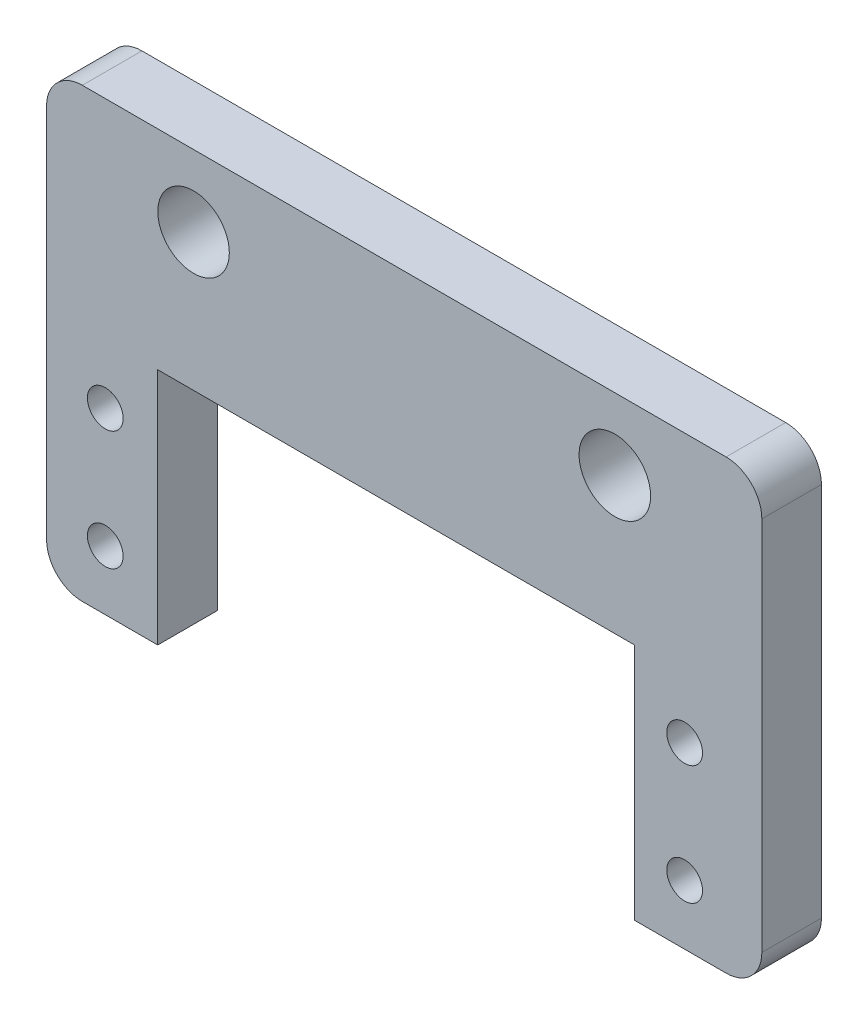
ISO-10303-21;
HEADER;
FILE_DESCRIPTION(('STEP AP214'),'2;1');
FILE_NAME('part.step','',(''),(''),'','','');
FILE_SCHEMA(('AUTOMOTIVE_DESIGN { 1 0 10303 214 1 1 1 1 }'));
ENDSEC;
DATA;
#1=APPLICATION_CONTEXT('core data for automotive mechanical design processes');
#2=APPLICATION_PROTOCOL_DEFINITION('international standard','automotive_design',2000,#1);
#3=PRODUCT_CONTEXT('',#1,'mechanical');
#4=PRODUCT('Part','Part','',(#3));
#5=PRODUCT_RELATED_PRODUCT_CATEGORY('part','',(#4));
#6=PRODUCT_DEFINITION_FORMATION('','',#4);
#7=PRODUCT_DEFINITION_CONTEXT('part definition',#1,'design');
#8=PRODUCT_DEFINITION('design','',#6,#7);
#9=PRODUCT_DEFINITION_SHAPE('','',#8);
#10=(LENGTH_UNIT() NAMED_UNIT(*) SI_UNIT(.MILLI.,.METRE.));
#11=(NAMED_UNIT(*) PLANE_ANGLE_UNIT() SI_UNIT($,.RADIAN.));
#12=(NAMED_UNIT(*) SI_UNIT($,.STERADIAN.) SOLID_ANGLE_UNIT());
#13=UNCERTAINTY_MEASURE_WITH_UNIT(LENGTH_MEASURE(1.E-05),#10,'distance_accuracy_value','');
#14=(GEOMETRIC_REPRESENTATION_CONTEXT(3) GLOBAL_UNCERTAINTY_ASSIGNED_CONTEXT((#13)) GLOBAL_UNIT_ASSIGNED_CONTEXT((#10,
#11,#12)) REPRESENTATION_CONTEXT('',''));
#15=CARTESIAN_POINT('',(0.,0.,0.));
#16=DIRECTION('',(0.,0.,1.));
#17=DIRECTION('',(1.,0.,0.));
#18=AXIS2_PLACEMENT_3D('',#15,#16,#17);
#19=CARTESIAN_POINT('',(-15.5,-7.,5.));
#20=DIRECTION('',(0.,0.,1.));
#21=DIRECTION('',(1.,0.,0.));
#22=AXIS2_PLACEMENT_3D('',#19,#20,#21);
#23=PLANE('',#22);
#24=CARTESIAN_POINT('',(-6.17,21.5,5.));
#25=DIRECTION('',(0.,0.,1.));
#26=DIRECTION('',(1.,0.,0.));
#27=AXIS2_PLACEMENT_3D('',#24,#25,#26);
#28=CIRCLE('',#27,3.);
#29=CARTESIAN_POINT('',(-3.17,21.5,5.));
#30=VERTEX_POINT('',#29);
#31=EDGE_CURVE('E214',#30,#30,#28,.T.);
#32=ORIENTED_EDGE('',*,*,#31,.F.);
#33=EDGE_LOOP('',(#32));
#34=FACE_BOUND('',#33,.T.);
#35=CARTESIAN_POINT('',(29.17,21.5,5.));
#36=DIRECTION('',(0.,0.,1.));
#37=DIRECTION('',(1.,0.,0.));
#38=AXIS2_PLACEMENT_3D('',#35,#36,#37);
#39=CIRCLE('',#38,3.);
#40=CARTESIAN_POINT('',(32.17,21.5,5.));
#41=VERTEX_POINT('',#40);
#42=EDGE_CURVE('E220',#41,#41,#39,.T.);
#43=ORIENTED_EDGE('',*,*,#42,.F.);
#44=EDGE_LOOP('',(#43));
#45=FACE_BOUND('',#44,.T.);
#46=CARTESIAN_POINT('',(35.025,5.,5.));
#47=DIRECTION('',(0.,0.,1.));
#48=DIRECTION('',(1.,0.,0.));
#49=AXIS2_PLACEMENT_3D('',#46,#47,#48);
#50=CIRCLE('',#49,1.5);
#51=CARTESIAN_POINT('',(36.525,5.,5.));
#52=VERTEX_POINT('',#51);
#53=EDGE_CURVE('E229',#52,#52,#50,.T.);
#54=ORIENTED_EDGE('',*,*,#53,.F.);
#55=EDGE_LOOP('',(#54));
#56=FACE_BOUND('',#55,.T.);
#57=CARTESIAN_POINT('',(-13.575,5.,5.));
#58=DIRECTION('',(0.,0.,1.));
#59=DIRECTION('',(1.,0.,0.));
#60=AXIS2_PLACEMENT_3D('',#57,#58,#59);
#61=CIRCLE('',#60,1.5);
#62=CARTESIAN_POINT('',(-12.075,5.,5.));
#63=VERTEX_POINT('',#62);
#64=EDGE_CURVE('E168',#63,#63,#61,.T.);
#65=ORIENTED_EDGE('',*,*,#64,.F.);
#66=EDGE_LOOP('',(#65));
#67=FACE_BOUND('',#66,.T.);
#68=DIRECTION('',(1.,0.,0.));
#69=VECTOR('',#68,1.);
#70=CARTESIAN_POINT('',(33.3,-9.99999999999999,5.));
#71=LINE('',#70,#69);
#72=CARTESIAN_POINT('',(30.825,-9.99999999999999,5.));
#73=VERTEX_POINT('',#72);
#74=CARTESIAN_POINT('',(38.5,-9.99999999999999,5.));
#75=VERTEX_POINT('',#74);
#76=EDGE_CURVE('E112',#73,#75,#71,.T.);
#77=ORIENTED_EDGE('',*,*,#76,.T.);
#78=CARTESIAN_POINT('',(38.5,-6.99999999999999,5.));
#79=DIRECTION('',(0.,0.,1.));
#80=DIRECTION('',(1.,0.,0.));
#81=AXIS2_PLACEMENT_3D('',#78,#79,#80);
#82=CIRCLE('',#81,3.);
#83=CARTESIAN_POINT('',(41.5,-6.99999999999997,5.));
#84=VERTEX_POINT('',#83);
#85=EDGE_CURVE('E250',#75,#84,#82,.T.);
#86=ORIENTED_EDGE('',*,*,#85,.T.);
#87=DIRECTION('',(0.,1.,0.));
#88=VECTOR('',#87,1.);
#89=CARTESIAN_POINT('',(41.5,24.5,5.));
#90=LINE('',#89,#88);
#91=CARTESIAN_POINT('',(41.5,24.5,5.));
#92=VERTEX_POINT('',#91);
#93=EDGE_CURVE('E248',#84,#92,#90,.T.);
#94=ORIENTED_EDGE('',*,*,#93,.T.);
#95=CARTESIAN_POINT('',(38.5,24.5,5.));
#96=DIRECTION('',(0.,0.,1.));
#97=DIRECTION('',(-1.,0.,0.));
#98=AXIS2_PLACEMENT_3D('',#95,#96,#97);
#99=CIRCLE('',#98,3.);
#100=CARTESIAN_POINT('',(38.5,27.5,5.));
#101=VERTEX_POINT('',#100);
#102=EDGE_CURVE('E252',#92,#101,#99,.T.);
#103=ORIENTED_EDGE('',*,*,#102,.T.);
#104=DIRECTION('',(-1.,0.,0.));
#105=VECTOR('',#104,1.);
#106=CARTESIAN_POINT('',(-15.5,27.5,5.));
#107=LINE('',#106,#105);
#108=CARTESIAN_POINT('',(-15.5,27.5,5.));
#109=VERTEX_POINT('',#108);
#110=EDGE_CURVE('E254',#101,#109,#107,.T.);
#111=ORIENTED_EDGE('',*,*,#110,.T.);
#112=CARTESIAN_POINT('',(-15.5,24.5,5.));
#113=DIRECTION('',(0.,0.,1.));
#114=DIRECTION('',(1.,0.,0.));
#115=AXIS2_PLACEMENT_3D('',#112,#113,#114);
#116=CIRCLE('',#115,3.);
#117=CARTESIAN_POINT('',(-18.5,24.5,5.));
#118=VERTEX_POINT('',#117);
#119=EDGE_CURVE('E253',#109,#118,#116,.T.);
#120=ORIENTED_EDGE('',*,*,#119,.T.);
#121=DIRECTION('',(0.,-1.,0.));
#122=VECTOR('',#121,1.);
#123=CARTESIAN_POINT('',(-18.5,24.5,5.));
#124=LINE('',#123,#122);
#125=CARTESIAN_POINT('',(-18.5,-6.99999999999998,5.));
#126=VERTEX_POINT('',#125);
#127=EDGE_CURVE('E256',#118,#126,#124,.T.);
#128=ORIENTED_EDGE('',*,*,#127,.T.);
#129=CARTESIAN_POINT('',(-15.5,-7.,5.));
#130=DIRECTION('',(0.,0.,1.));
#131=DIRECTION('',(1.,0.,0.));
#132=AXIS2_PLACEMENT_3D('',#129,#130,#131);
#133=CIRCLE('',#132,3.);
#134=CARTESIAN_POINT('',(-15.5,-10.,5.));
#135=VERTEX_POINT('',#134);
#136=EDGE_CURVE('E258',#126,#135,#133,.T.);
#137=ORIENTED_EDGE('',*,*,#136,.T.);
#138=DIRECTION('',(1.,0.,0.));
#139=VECTOR('',#138,1.);
#140=CARTESIAN_POINT('',(-15.5,-10.,5.));
#141=LINE('',#140,#139);
#142=CARTESIAN_POINT('',(-9.17500000000001,-10.,5.));
#143=VERTEX_POINT('',#142);
#144=EDGE_CURVE('E149',#135,#143,#141,.T.);
#145=ORIENTED_EDGE('',*,*,#144,.T.);
#146=DIRECTION('',(0.,1.,0.));
#147=VECTOR('',#146,1.);
#148=CARTESIAN_POINT('',(-9.17500000000001,10.,5.));
#149=LINE('',#148,#147);
#150=CARTESIAN_POINT('',(-9.17500000000001,10.,5.));
#151=VERTEX_POINT('',#150);
#152=EDGE_CURVE('E139',#143,#151,#149,.T.);
#153=ORIENTED_EDGE('',*,*,#152,.T.);
#154=DIRECTION('',(1.,0.,0.));
#155=VECTOR('',#154,1.);
#156=CARTESIAN_POINT('',(30.825,10.,5.));
#157=LINE('',#156,#155);
#158=CARTESIAN_POINT('',(30.825,10.,5.));
#159=VERTEX_POINT('',#158);
#160=EDGE_CURVE('E144',#151,#159,#157,.T.);
#161=ORIENTED_EDGE('',*,*,#160,.T.);
#162=DIRECTION('',(0.,-1.,0.));
#163=VECTOR('',#162,1.);
#164=CARTESIAN_POINT('',(30.825,10.,5.));
#165=LINE('',#164,#163);
#166=EDGE_CURVE('E58',#159,#73,#165,.T.);
#167=ORIENTED_EDGE('',*,*,#166,.T.);
#168=EDGE_LOOP('',(#77,#86,#94,#103,#111,#120,#128,#137,#145,#153,#161,#167));
#169=FACE_BOUND('',#168,.T.);
#170=CARTESIAN_POINT('',(-13.575,-5.00000000000001,5.));
#171=DIRECTION('',(0.,0.,1.));
#172=DIRECTION('',(1.,0.,0.));
#173=AXIS2_PLACEMENT_3D('',#170,#171,#172);
#174=CIRCLE('',#173,1.5);
#175=CARTESIAN_POINT('',(-12.075,-5.00000000000001,5.));
#176=VERTEX_POINT('',#175);
#177=EDGE_CURVE('E236',#176,#176,#174,.T.);
#178=ORIENTED_EDGE('',*,*,#177,.F.);
#179=EDGE_LOOP('',(#178));
#180=FACE_BOUND('',#179,.T.);
#181=CARTESIAN_POINT('',(35.025,-5.,5.));
#182=DIRECTION('',(0.,0.,1.));
#183=DIRECTION('',(1.,0.,0.));
#184=AXIS2_PLACEMENT_3D('',#181,#182,#183);
#185=CIRCLE('',#184,1.5);
#186=CARTESIAN_POINT('',(36.525,-5.,5.));
#187=VERTEX_POINT('',#186);
#188=EDGE_CURVE('E223',#187,#187,#185,.T.);
#189=ORIENTED_EDGE('',*,*,#188,.F.);
#190=EDGE_LOOP('',(#189));
#191=FACE_BOUND('',#190,.T.);
#192=ADVANCED_FACE('F41',(#34,#45,#56,#67,#169,#180,#191),#23,.T.);
#193=CARTESIAN_POINT('',(-15.5,-7.,0.));
#194=DIRECTION('',(0.,0.,1.));
#195=DIRECTION('',(1.,0.,0.));
#196=AXIS2_PLACEMENT_3D('',#193,#194,#195);
#197=PLANE('',#196);
#198=CARTESIAN_POINT('',(-6.17,21.5,0.));
#199=DIRECTION('',(0.,0.,1.));
#200=DIRECTION('',(1.,0.,0.));
#201=AXIS2_PLACEMENT_3D('',#198,#199,#200);
#202=CIRCLE('',#201,3.);
#203=CARTESIAN_POINT('',(-3.17,21.5,0.));
#204=VERTEX_POINT('',#203);
#205=EDGE_CURVE('E44',#204,#204,#202,.T.);
#206=ORIENTED_EDGE('',*,*,#205,.T.);
#207=EDGE_LOOP('',(#206));
#208=FACE_BOUND('',#207,.T.);
#209=CARTESIAN_POINT('',(29.17,21.5,0.));
#210=DIRECTION('',(0.,0.,1.));
#211=DIRECTION('',(1.,0.,0.));
#212=AXIS2_PLACEMENT_3D('',#209,#210,#211);
#213=CIRCLE('',#212,3.);
#214=CARTESIAN_POINT('',(32.17,21.5,0.));
#215=VERTEX_POINT('',#214);
#216=EDGE_CURVE('E209',#215,#215,#213,.T.);
#217=ORIENTED_EDGE('',*,*,#216,.T.);
#218=EDGE_LOOP('',(#217));
#219=FACE_BOUND('',#218,.T.);
#220=DIRECTION('',(1.,0.,0.));
#221=VECTOR('',#220,1.);
#222=CARTESIAN_POINT('',(33.3,-9.99999999999999,0.));
#223=LINE('',#222,#221);
#224=CARTESIAN_POINT('',(30.825,-9.99999999999999,0.));
#225=VERTEX_POINT('',#224);
#226=CARTESIAN_POINT('',(38.5,-9.99999999999999,0.));
#227=VERTEX_POINT('',#226);
#228=EDGE_CURVE('E108',#225,#227,#223,.T.);
#229=ORIENTED_EDGE('',*,*,#228,.F.);
#230=DIRECTION('',(0.,-1.,0.));
#231=VECTOR('',#230,1.);
#232=CARTESIAN_POINT('',(30.825,10.,0.));
#233=LINE('',#232,#231);
#234=CARTESIAN_POINT('',(30.825,10.,0.));
#235=VERTEX_POINT('',#234);
#236=EDGE_CURVE('E183',#235,#225,#233,.T.);
#237=ORIENTED_EDGE('',*,*,#236,.F.);
#238=DIRECTION('',(1.,0.,0.));
#239=VECTOR('',#238,1.);
#240=CARTESIAN_POINT('',(30.825,10.,0.));
#241=LINE('',#240,#239);
#242=CARTESIAN_POINT('',(-9.17500000000001,10.,0.));
#243=VERTEX_POINT('',#242);
#244=EDGE_CURVE('E103',#243,#235,#241,.T.);
#245=ORIENTED_EDGE('',*,*,#244,.F.);
#246=DIRECTION('',(0.,1.,0.));
#247=VECTOR('',#246,1.);
#248=CARTESIAN_POINT('',(-9.17500000000001,10.,0.));
#249=LINE('',#248,#247);
#250=CARTESIAN_POINT('',(-9.17500000000001,-10.,0.));
#251=VERTEX_POINT('',#250);
#252=EDGE_CURVE('E153',#251,#243,#249,.T.);
#253=ORIENTED_EDGE('',*,*,#252,.F.);
#254=DIRECTION('',(1.,0.,0.));
#255=VECTOR('',#254,1.);
#256=CARTESIAN_POINT('',(-15.5,-10.,0.));
#257=LINE('',#256,#255);
#258=CARTESIAN_POINT('',(-15.5,-10.,0.));
#259=VERTEX_POINT('',#258);
#260=EDGE_CURVE('E179',#259,#251,#257,.T.);
#261=ORIENTED_EDGE('',*,*,#260,.F.);
#262=CARTESIAN_POINT('',(-15.5,-7.,0.));
#263=DIRECTION('',(0.,0.,1.));
#264=DIRECTION('',(1.,0.,0.));
#265=AXIS2_PLACEMENT_3D('',#262,#263,#264);
#266=CIRCLE('',#265,3.);
#267=CARTESIAN_POINT('',(-18.5,-6.99999999999998,0.));
#268=VERTEX_POINT('',#267);
#269=EDGE_CURVE('E178',#268,#259,#266,.T.);
#270=ORIENTED_EDGE('',*,*,#269,.F.);
#271=DIRECTION('',(0.,-1.,0.));
#272=VECTOR('',#271,1.);
#273=CARTESIAN_POINT('',(-18.5,24.5,0.));
#274=LINE('',#273,#272);
#275=CARTESIAN_POINT('',(-18.5,24.5,0.));
#276=VERTEX_POINT('',#275);
#277=EDGE_CURVE('E176',#276,#268,#274,.T.);
#278=ORIENTED_EDGE('',*,*,#277,.F.);
#279=CARTESIAN_POINT('',(-15.5,24.5,0.));
#280=DIRECTION('',(0.,0.,1.));
#281=DIRECTION('',(1.,0.,0.));
#282=AXIS2_PLACEMENT_3D('',#279,#280,#281);
#283=CIRCLE('',#282,3.);
#284=CARTESIAN_POINT('',(-15.5,27.5,0.));
#285=VERTEX_POINT('',#284);
#286=EDGE_CURVE('E172',#285,#276,#283,.T.);
#287=ORIENTED_EDGE('',*,*,#286,.F.);
#288=DIRECTION('',(-1.,0.,0.));
#289=VECTOR('',#288,1.);
#290=CARTESIAN_POINT('',(-15.5,27.5,0.));
#291=LINE('',#290,#289);
#292=CARTESIAN_POINT('',(38.5,27.5,0.));
#293=VERTEX_POINT('',#292);
#294=EDGE_CURVE('E175',#293,#285,#291,.T.);
#295=ORIENTED_EDGE('',*,*,#294,.F.);
#296=CARTESIAN_POINT('',(38.5,24.5,0.));
#297=DIRECTION('',(0.,0.,1.));
#298=DIRECTION('',(-1.,0.,0.));
#299=AXIS2_PLACEMENT_3D('',#296,#297,#298);
#300=CIRCLE('',#299,3.);
#301=CARTESIAN_POINT('',(41.5,24.5,0.));
#302=VERTEX_POINT('',#301);
#303=EDGE_CURVE('E167',#302,#293,#300,.T.);
#304=ORIENTED_EDGE('',*,*,#303,.F.);
#305=DIRECTION('',(0.,1.,0.));
#306=VECTOR('',#305,1.);
#307=CARTESIAN_POINT('',(41.5,24.5,0.));
#308=LINE('',#307,#306);
#309=CARTESIAN_POINT('',(41.5,-6.99999999999997,0.));
#310=VERTEX_POINT('',#309);
#311=EDGE_CURVE('E166',#310,#302,#308,.T.);
#312=ORIENTED_EDGE('',*,*,#311,.F.);
#313=CARTESIAN_POINT('',(38.5,-6.99999999999999,0.));
#314=DIRECTION('',(0.,0.,1.));
#315=DIRECTION('',(1.,0.,0.));
#316=AXIS2_PLACEMENT_3D('',#313,#314,#315);
#317=CIRCLE('',#316,3.);
#318=EDGE_CURVE('E164',#227,#310,#317,.T.);
#319=ORIENTED_EDGE('',*,*,#318,.F.);
#320=EDGE_LOOP('',(#229,#237,#245,#253,#261,#270,#278,#287,#295,#304,#312,#319));
#321=FACE_BOUND('',#320,.T.);
#322=CARTESIAN_POINT('',(-13.575,5.,0.));
#323=DIRECTION('',(0.,0.,1.));
#324=DIRECTION('',(1.,0.,0.));
#325=AXIS2_PLACEMENT_3D('',#322,#323,#324);
#326=CIRCLE('',#325,1.5);
#327=CARTESIAN_POINT('',(-12.075,5.,0.));
#328=VERTEX_POINT('',#327);
#329=EDGE_CURVE('E237',#328,#328,#326,.T.);
#330=ORIENTED_EDGE('',*,*,#329,.T.);
#331=EDGE_LOOP('',(#330));
#332=FACE_BOUND('',#331,.T.);
#333=CARTESIAN_POINT('',(-13.575,-5.00000000000001,0.));
#334=DIRECTION('',(0.,0.,1.));
#335=DIRECTION('',(1.,0.,0.));
#336=AXIS2_PLACEMENT_3D('',#333,#334,#335);
#337=CIRCLE('',#336,1.5);
#338=CARTESIAN_POINT('',(-12.075,-5.00000000000001,0.));
#339=VERTEX_POINT('',#338);
#340=EDGE_CURVE('E231',#339,#339,#337,.T.);
#341=ORIENTED_EDGE('',*,*,#340,.T.);
#342=EDGE_LOOP('',(#341));
#343=FACE_BOUND('',#342,.T.);
#344=CARTESIAN_POINT('',(35.025,5.,0.));
#345=DIRECTION('',(0.,0.,1.));
#346=DIRECTION('',(1.,0.,0.));
#347=AXIS2_PLACEMENT_3D('',#344,#345,#346);
#348=CIRCLE('',#347,1.5);
#349=CARTESIAN_POINT('',(36.525,5.,0.));
#350=VERTEX_POINT('',#349);
#351=EDGE_CURVE('E227',#350,#350,#348,.T.);
#352=ORIENTED_EDGE('',*,*,#351,.T.);
#353=EDGE_LOOP('',(#352));
#354=FACE_BOUND('',#353,.T.);
#355=CARTESIAN_POINT('',(35.025,-5.,0.));
#356=DIRECTION('',(0.,0.,1.));
#357=DIRECTION('',(1.,0.,0.));
#358=AXIS2_PLACEMENT_3D('',#355,#356,#357);
#359=CIRCLE('',#358,1.5);
#360=CARTESIAN_POINT('',(36.525,-5.,0.));
#361=VERTEX_POINT('',#360);
#362=EDGE_CURVE('E212',#361,#361,#359,.T.);
#363=ORIENTED_EDGE('',*,*,#362,.T.);
#364=EDGE_LOOP('',(#363));
#365=FACE_BOUND('',#364,.T.);
#366=ADVANCED_FACE('F269',(#208,#219,#321,#332,#343,#354,#365),#197,.F.);
#367=CARTESIAN_POINT('',(33.3,-9.99999999999999,5.));
#368=DIRECTION('',(0.,1.,0.));
#369=DIRECTION('',(0.,0.,1.));
#370=AXIS2_PLACEMENT_3D('',#367,#368,#369);
#371=PLANE('',#370);
#372=ORIENTED_EDGE('',*,*,#228,.T.);
#373=DIRECTION('',(0.,0.,-1.));
#374=VECTOR('',#373,1.);
#375=CARTESIAN_POINT('',(38.5,-9.99999999999999,5.));
#376=LINE('',#375,#374);
#377=EDGE_CURVE('E11',#75,#227,#376,.T.);
#378=ORIENTED_EDGE('',*,*,#377,.F.);
#379=ORIENTED_EDGE('',*,*,#76,.F.);
#380=DIRECTION('',(0.,0.,-1.));
#381=VECTOR('',#380,1.);
#382=CARTESIAN_POINT('',(30.825,-9.99999999999999,5.));
#383=LINE('',#382,#381);
#384=EDGE_CURVE('E159',#73,#225,#383,.T.);
#385=ORIENTED_EDGE('',*,*,#384,.T.);
#386=EDGE_LOOP('',(#372,#378,#379,#385));
#387=FACE_BOUND('',#386,.T.);
#388=ADVANCED_FACE('F43',(#387),#371,.F.);
#389=CARTESIAN_POINT('',(38.5,-6.99999999999999,5.));
#390=DIRECTION('',(0.,0.,-1.));
#391=DIRECTION('',(-1.,0.,0.));
#392=AXIS2_PLACEMENT_3D('',#389,#390,#391);
#393=CYLINDRICAL_SURFACE('',#392,3.);
#394=ORIENTED_EDGE('',*,*,#318,.T.);
#395=DIRECTION('',(0.,0.,-1.));
#396=VECTOR('',#395,1.);
#397=CARTESIAN_POINT('',(41.5,-6.99999999999997,5.));
#398=LINE('',#397,#396);
#399=EDGE_CURVE('E51',#84,#310,#398,.T.);
#400=ORIENTED_EDGE('',*,*,#399,.F.);
#401=ORIENTED_EDGE('',*,*,#85,.F.);
#402=ORIENTED_EDGE('',*,*,#377,.T.);
#403=EDGE_LOOP('',(#394,#400,#401,#402));
#404=FACE_BOUND('',#403,.T.);
#405=ADVANCED_FACE('F280',(#404),#393,.T.);
#406=CARTESIAN_POINT('',(41.5,24.5,5.));
#407=DIRECTION('',(-1.,0.,0.));
#408=DIRECTION('',(0.,-1.,0.));
#409=AXIS2_PLACEMENT_3D('',#406,#407,#408);
#410=PLANE('',#409);
#411=ORIENTED_EDGE('',*,*,#311,.T.);
#412=DIRECTION('',(0.,0.,-1.));
#413=VECTOR('',#412,1.);
#414=CARTESIAN_POINT('',(41.5,24.5,5.));
#415=LINE('',#414,#413);
#416=EDGE_CURVE('E204',#92,#302,#415,.T.);
#417=ORIENTED_EDGE('',*,*,#416,.F.);
#418=ORIENTED_EDGE('',*,*,#93,.F.);
#419=ORIENTED_EDGE('',*,*,#399,.T.);
#420=EDGE_LOOP('',(#411,#417,#418,#419));
#421=FACE_BOUND('',#420,.T.);
#422=ADVANCED_FACE('F283',(#421),#410,.F.);
#423=CARTESIAN_POINT('',(38.5,24.5,5.));
#424=DIRECTION('',(0.,0.,-1.));
#425=DIRECTION('',(-1.,0.,0.));
#426=AXIS2_PLACEMENT_3D('',#423,#424,#425);
#427=CYLINDRICAL_SURFACE('',#426,3.);
#428=ORIENTED_EDGE('',*,*,#303,.T.);
#429=DIRECTION('',(0.,0.,-1.));
#430=VECTOR('',#429,1.);
#431=CARTESIAN_POINT('',(38.5,27.5,5.));
#432=LINE('',#431,#430);
#433=EDGE_CURVE('E205',#101,#293,#432,.T.);
#434=ORIENTED_EDGE('',*,*,#433,.F.);
#435=ORIENTED_EDGE('',*,*,#102,.F.);
#436=ORIENTED_EDGE('',*,*,#416,.T.);
#437=EDGE_LOOP('',(#428,#434,#435,#436));
#438=FACE_BOUND('',#437,.T.);
#439=ADVANCED_FACE('F287',(#438),#427,.T.);
#440=CARTESIAN_POINT('',(-15.5,27.5,5.));
#441=DIRECTION('',(0.,-1.,0.));
#442=DIRECTION('',(1.,0.,0.));
#443=AXIS2_PLACEMENT_3D('',#440,#441,#442);
#444=PLANE('',#443);
#445=ORIENTED_EDGE('',*,*,#294,.T.);
#446=DIRECTION('',(0.,0.,-1.));
#447=VECTOR('',#446,1.);
#448=CARTESIAN_POINT('',(-15.5,27.5,5.));
#449=LINE('',#448,#447);
#450=EDGE_CURVE('E198',#109,#285,#449,.T.);
#451=ORIENTED_EDGE('',*,*,#450,.F.);
#452=ORIENTED_EDGE('',*,*,#110,.F.);
#453=ORIENTED_EDGE('',*,*,#433,.T.);
#454=EDGE_LOOP('',(#445,#451,#452,#453));
#455=FACE_BOUND('',#454,.T.);
#456=ADVANCED_FACE('F291',(#455),#444,.F.);
#457=CARTESIAN_POINT('',(-15.5,24.5,5.));
#458=DIRECTION('',(0.,0.,-1.));
#459=DIRECTION('',(-1.,0.,0.));
#460=AXIS2_PLACEMENT_3D('',#457,#458,#459);
#461=CYLINDRICAL_SURFACE('',#460,3.);
#462=ORIENTED_EDGE('',*,*,#286,.T.);
#463=DIRECTION('',(0.,0.,-1.));
#464=VECTOR('',#463,1.);
#465=CARTESIAN_POINT('',(-18.5,24.5,5.));
#466=LINE('',#465,#464);
#467=EDGE_CURVE('E196',#118,#276,#466,.T.);
#468=ORIENTED_EDGE('',*,*,#467,.F.);
#469=ORIENTED_EDGE('',*,*,#119,.F.);
#470=ORIENTED_EDGE('',*,*,#450,.T.);
#471=EDGE_LOOP('',(#462,#468,#469,#470));
#472=FACE_BOUND('',#471,.T.);
#473=ADVANCED_FACE('F300',(#472),#461,.T.);
#474=CARTESIAN_POINT('',(-18.5,24.5,5.));
#475=DIRECTION('',(1.,0.,0.));
#476=DIRECTION('',(0.,1.,0.));
#477=AXIS2_PLACEMENT_3D('',#474,#475,#476);
#478=PLANE('',#477);
#479=ORIENTED_EDGE('',*,*,#277,.T.);
#480=DIRECTION('',(0.,0.,-1.));
#481=VECTOR('',#480,1.);
#482=CARTESIAN_POINT('',(-18.5,-6.99999999999998,5.));
#483=LINE('',#482,#481);
#484=EDGE_CURVE('E195',#126,#268,#483,.T.);
#485=ORIENTED_EDGE('',*,*,#484,.F.);
#486=ORIENTED_EDGE('',*,*,#127,.F.);
#487=ORIENTED_EDGE('',*,*,#467,.T.);
#488=EDGE_LOOP('',(#479,#485,#486,#487));
#489=FACE_BOUND('',#488,.T.);
#490=ADVANCED_FACE('F301',(#489),#478,.F.);
#491=CARTESIAN_POINT('',(-15.5,-7.,5.));
#492=DIRECTION('',(0.,0.,-1.));
#493=DIRECTION('',(-1.,0.,0.));
#494=AXIS2_PLACEMENT_3D('',#491,#492,#493);
#495=CYLINDRICAL_SURFACE('',#494,3.);
#496=ORIENTED_EDGE('',*,*,#269,.T.);
#497=DIRECTION('',(0.,0.,-1.));
#498=VECTOR('',#497,1.);
#499=CARTESIAN_POINT('',(-15.5,-10.,5.));
#500=LINE('',#499,#498);
#501=EDGE_CURVE('E188',#135,#259,#500,.T.);
#502=ORIENTED_EDGE('',*,*,#501,.F.);
#503=ORIENTED_EDGE('',*,*,#136,.F.);
#504=ORIENTED_EDGE('',*,*,#484,.T.);
#505=EDGE_LOOP('',(#496,#502,#503,#504));
#506=FACE_BOUND('',#505,.T.);
#507=ADVANCED_FACE('F264',(#506),#495,.T.);
#508=CARTESIAN_POINT('',(-15.5,-10.,5.));
#509=DIRECTION('',(0.,1.,0.));
#510=DIRECTION('',(0.,0.,1.));
#511=AXIS2_PLACEMENT_3D('',#508,#509,#510);
#512=PLANE('',#511);
#513=ORIENTED_EDGE('',*,*,#260,.T.);
#514=DIRECTION('',(0.,0.,-1.));
#515=VECTOR('',#514,1.);
#516=CARTESIAN_POINT('',(-9.17500000000001,-10.,5.));
#517=LINE('',#516,#515);
#518=EDGE_CURVE('E154',#143,#251,#517,.T.);
#519=ORIENTED_EDGE('',*,*,#518,.F.);
#520=ORIENTED_EDGE('',*,*,#144,.F.);
#521=ORIENTED_EDGE('',*,*,#501,.T.);
#522=EDGE_LOOP('',(#513,#519,#520,#521));
#523=FACE_BOUND('',#522,.T.);
#524=ADVANCED_FACE('F268',(#523),#512,.F.);
#525=CARTESIAN_POINT('',(-9.17500000000001,10.,5.));
#526=DIRECTION('',(-1.,0.,0.));
#527=DIRECTION('',(0.,-1.,0.));
#528=AXIS2_PLACEMENT_3D('',#525,#526,#527);
#529=PLANE('',#528);
#530=ORIENTED_EDGE('',*,*,#252,.T.);
#531=DIRECTION('',(0.,0.,-1.));
#532=VECTOR('',#531,1.);
#533=CARTESIAN_POINT('',(-9.17500000000001,10.,5.));
#534=LINE('',#533,#532);
#535=EDGE_CURVE('E151',#151,#243,#534,.T.);
#536=ORIENTED_EDGE('',*,*,#535,.F.);
#537=ORIENTED_EDGE('',*,*,#152,.F.);
#538=ORIENTED_EDGE('',*,*,#518,.T.);
#539=EDGE_LOOP('',(#530,#536,#537,#538));
#540=FACE_BOUND('',#539,.T.);
#541=ADVANCED_FACE('F155',(#540),#529,.F.);
#542=CARTESIAN_POINT('',(30.825,10.,5.));
#543=DIRECTION('',(0.,1.,0.));
#544=DIRECTION('',(-1.,0.,0.));
#545=AXIS2_PLACEMENT_3D('',#542,#543,#544);
#546=PLANE('',#545);
#547=ORIENTED_EDGE('',*,*,#244,.T.);
#548=DIRECTION('',(0.,0.,-1.));
#549=VECTOR('',#548,1.);
#550=CARTESIAN_POINT('',(30.825,10.,5.));
#551=LINE('',#550,#549);
#552=EDGE_CURVE('E156',#159,#235,#551,.T.);
#553=ORIENTED_EDGE('',*,*,#552,.F.);
#554=ORIENTED_EDGE('',*,*,#160,.F.);
#555=ORIENTED_EDGE('',*,*,#535,.T.);
#556=EDGE_LOOP('',(#547,#553,#554,#555));
#557=FACE_BOUND('',#556,.T.);
#558=ADVANCED_FACE('F157',(#557),#546,.F.);
#559=CARTESIAN_POINT('',(30.825,10.,5.));
#560=DIRECTION('',(1.,0.,0.));
#561=DIRECTION('',(0.,1.,0.));
#562=AXIS2_PLACEMENT_3D('',#559,#560,#561);
#563=PLANE('',#562);
#564=ORIENTED_EDGE('',*,*,#236,.T.);
#565=ORIENTED_EDGE('',*,*,#384,.F.);
#566=ORIENTED_EDGE('',*,*,#166,.F.);
#567=ORIENTED_EDGE('',*,*,#552,.T.);
#568=EDGE_LOOP('',(#564,#565,#566,#567));
#569=FACE_BOUND('',#568,.T.);
#570=ADVANCED_FACE('F271',(#569),#563,.F.);
#571=CARTESIAN_POINT('',(-13.575,5.,5.));
#572=DIRECTION('',(0.,0.,-1.));
#573=DIRECTION('',(-1.,0.,0.));
#574=AXIS2_PLACEMENT_3D('',#571,#572,#573);
#575=CYLINDRICAL_SURFACE('',#574,1.5);
#576=ORIENTED_EDGE('',*,*,#64,.T.);
#577=EDGE_LOOP('',(#576));
#578=FACE_BOUND('',#577,.T.);
#579=ORIENTED_EDGE('',*,*,#329,.F.);
#580=EDGE_LOOP('',(#579));
#581=FACE_BOUND('',#580,.T.);
#582=ADVANCED_FACE('F324',(#578,#581),#575,.F.);
#583=CARTESIAN_POINT('',(-13.575,-5.00000000000001,5.));
#584=DIRECTION('',(0.,0.,-1.));
#585=DIRECTION('',(-1.,0.,0.));
#586=AXIS2_PLACEMENT_3D('',#583,#584,#585);
#587=CYLINDRICAL_SURFACE('',#586,1.5);
#588=ORIENTED_EDGE('',*,*,#177,.T.);
#589=EDGE_LOOP('',(#588));
#590=FACE_BOUND('',#589,.T.);
#591=ORIENTED_EDGE('',*,*,#340,.F.);
#592=EDGE_LOOP('',(#591));
#593=FACE_BOUND('',#592,.T.);
#594=ADVANCED_FACE('F357',(#590,#593),#587,.F.);
#595=CARTESIAN_POINT('',(35.025,5.,5.));
#596=DIRECTION('',(0.,0.,-1.));
#597=DIRECTION('',(-1.,0.,0.));
#598=AXIS2_PLACEMENT_3D('',#595,#596,#597);
#599=CYLINDRICAL_SURFACE('',#598,1.5);
#600=ORIENTED_EDGE('',*,*,#53,.T.);
#601=EDGE_LOOP('',(#600));
#602=FACE_BOUND('',#601,.T.);
#603=ORIENTED_EDGE('',*,*,#351,.F.);
#604=EDGE_LOOP('',(#603));
#605=FACE_BOUND('',#604,.T.);
#606=ADVANCED_FACE('F362',(#602,#605),#599,.F.);
#607=CARTESIAN_POINT('',(35.025,-5.,5.));
#608=DIRECTION('',(0.,0.,-1.));
#609=DIRECTION('',(-1.,0.,0.));
#610=AXIS2_PLACEMENT_3D('',#607,#608,#609);
#611=CYLINDRICAL_SURFACE('',#610,1.5);
#612=ORIENTED_EDGE('',*,*,#188,.T.);
#613=EDGE_LOOP('',(#612));
#614=FACE_BOUND('',#613,.T.);
#615=ORIENTED_EDGE('',*,*,#362,.F.);
#616=EDGE_LOOP('',(#615));
#617=FACE_BOUND('',#616,.T.);
#618=ADVANCED_FACE('F375',(#614,#617),#611,.F.);
#619=CARTESIAN_POINT('',(29.17,21.5,-5.));
#620=DIRECTION('',(0.,0.,1.));
#621=DIRECTION('',(1.,0.,0.));
#622=AXIS2_PLACEMENT_3D('',#619,#620,#621);
#623=CYLINDRICAL_SURFACE('',#622,3.);
#624=ORIENTED_EDGE('',*,*,#42,.T.);
#625=EDGE_LOOP('',(#624));
#626=FACE_BOUND('',#625,.T.);
#627=ORIENTED_EDGE('',*,*,#216,.F.);
#628=EDGE_LOOP('',(#627));
#629=FACE_BOUND('',#628,.T.);
#630=ADVANCED_FACE('F379',(#626,#629),#623,.F.);
#631=CARTESIAN_POINT('',(-6.17,21.5,-5.));
#632=DIRECTION('',(0.,0.,1.));
#633=DIRECTION('',(1.,0.,0.));
#634=AXIS2_PLACEMENT_3D('',#631,#632,#633);
#635=CYLINDRICAL_SURFACE('',#634,3.);
#636=ORIENTED_EDGE('',*,*,#31,.T.);
#637=EDGE_LOOP('',(#636));
#638=FACE_BOUND('',#637,.T.);
#639=ORIENTED_EDGE('',*,*,#205,.F.);
#640=EDGE_LOOP('',(#639));
#641=FACE_BOUND('',#640,.T.);
#642=ADVANCED_FACE('F392',(#638,#641),#635,.F.);
#643=CLOSED_SHELL('',(#192,#366,#388,#405,#422,#439,#456,#473,#490,#507,#524,#541,#558,#570,
#582,#594,#606,#618,#630,#642));
#644=MANIFOLD_SOLID_BREP('B2',#643);
#645=ADVANCED_BREP_SHAPE_REPRESENTATION('',(#18,#644),#14);
#646=SHAPE_DEFINITION_REPRESENTATION(#9,#645);
ENDSEC;
END-ISO-10303-21;
